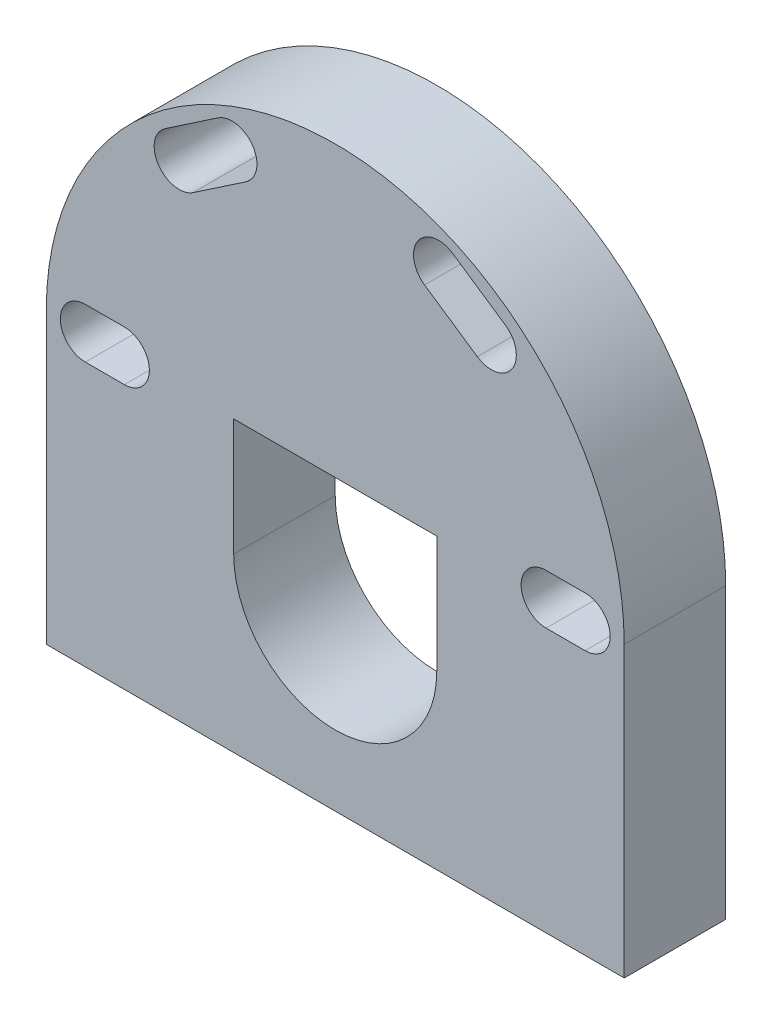
ISO-10303-21;
HEADER;
FILE_DESCRIPTION(('STEP AP214'),'2;1');
FILE_NAME('part.step','',(''),(''),'','','');
FILE_SCHEMA(('AUTOMOTIVE_DESIGN { 1 0 10303 214 1 1 1 1 }'));
ENDSEC;
DATA;
#1=APPLICATION_CONTEXT('core data for automotive mechanical design processes');
#2=APPLICATION_PROTOCOL_DEFINITION('international standard','automotive_design',2000,#1);
#3=PRODUCT_CONTEXT('',#1,'mechanical');
#4=PRODUCT('Part','Part','',(#3));
#5=PRODUCT_RELATED_PRODUCT_CATEGORY('part','',(#4));
#6=PRODUCT_DEFINITION_FORMATION('','',#4);
#7=PRODUCT_DEFINITION_CONTEXT('part definition',#1,'design');
#8=PRODUCT_DEFINITION('design','',#6,#7);
#9=PRODUCT_DEFINITION_SHAPE('','',#8);
#10=(LENGTH_UNIT() NAMED_UNIT(*) SI_UNIT(.MILLI.,.METRE.));
#11=(NAMED_UNIT(*) PLANE_ANGLE_UNIT() SI_UNIT($,.RADIAN.));
#12=(NAMED_UNIT(*) SI_UNIT($,.STERADIAN.) SOLID_ANGLE_UNIT());
#13=UNCERTAINTY_MEASURE_WITH_UNIT(LENGTH_MEASURE(1.E-05),#10,'distance_accuracy_value','');
#14=(GEOMETRIC_REPRESENTATION_CONTEXT(3) GLOBAL_UNCERTAINTY_ASSIGNED_CONTEXT((#13)) GLOBAL_UNIT_ASSIGNED_CONTEXT((#10,
#11,#12)) REPRESENTATION_CONTEXT('',''));
#15=CARTESIAN_POINT('',(0.,0.,0.));
#16=DIRECTION('',(0.,0.,1.));
#17=DIRECTION('',(1.,0.,0.));
#18=AXIS2_PLACEMENT_3D('',#15,#16,#17);
#19=CARTESIAN_POINT('',(0.,0.,0.));
#20=DIRECTION('',(0.,0.,1.));
#21=DIRECTION('',(1.,0.,0.));
#22=AXIS2_PLACEMENT_3D('',#19,#20,#21);
#23=PLANE('',#22);
#24=DIRECTION('',(-1.,0.,0.));
#25=VECTOR('',#24,1.);
#26=CARTESIAN_POINT('',(-16.,1.6,0.));
#27=LINE('',#26,#25);
#28=CARTESIAN_POINT('',(-13.5,1.6,0.));
#29=VERTEX_POINT('',#28);
#30=CARTESIAN_POINT('',(-16.,1.6,0.));
#31=VERTEX_POINT('',#30);
#32=EDGE_CURVE('E276',#29,#31,#27,.T.);
#33=ORIENTED_EDGE('',*,*,#32,.T.);
#34=CARTESIAN_POINT('',(-16.,0.,0.));
#35=DIRECTION('',(0.,0.,1.));
#36=DIRECTION('',(1.,0.,0.));
#37=AXIS2_PLACEMENT_3D('',#34,#35,#36);
#38=CIRCLE('',#37,1.6);
#39=CARTESIAN_POINT('',(-16.,-1.6,0.));
#40=VERTEX_POINT('',#39);
#41=EDGE_CURVE('E241',#31,#40,#38,.T.);
#42=ORIENTED_EDGE('',*,*,#41,.T.);
#43=DIRECTION('',(1.,0.,0.));
#44=VECTOR('',#43,1.);
#45=CARTESIAN_POINT('',(-16.,-1.6,0.));
#46=LINE('',#45,#44);
#47=CARTESIAN_POINT('',(-13.5,-1.6,0.));
#48=VERTEX_POINT('',#47);
#49=EDGE_CURVE('E282',#40,#48,#46,.T.);
#50=ORIENTED_EDGE('',*,*,#49,.T.);
#51=CARTESIAN_POINT('',(-13.5,0.,0.));
#52=DIRECTION('',(0.,0.,1.));
#53=DIRECTION('',(1.,0.,0.));
#54=AXIS2_PLACEMENT_3D('',#51,#52,#53);
#55=CIRCLE('',#54,1.6);
#56=EDGE_CURVE('E279',#48,#29,#55,.T.);
#57=ORIENTED_EDGE('',*,*,#56,.T.);
#58=EDGE_LOOP('',(#33,#42,#50,#57));
#59=FACE_BOUND('',#58,.T.);
#60=DIRECTION('',(1.,0.,0.));
#61=VECTOR('',#60,1.);
#62=CARTESIAN_POINT('',(16.,-1.6,0.));
#63=LINE('',#62,#61);
#64=CARTESIAN_POINT('',(13.5,-1.6,0.));
#65=VERTEX_POINT('',#64);
#66=CARTESIAN_POINT('',(16.,-1.6,0.));
#67=VERTEX_POINT('',#66);
#68=EDGE_CURVE('E281',#65,#67,#63,.T.);
#69=ORIENTED_EDGE('',*,*,#68,.T.);
#70=CARTESIAN_POINT('',(16.,0.,0.));
#71=DIRECTION('',(0.,0.,1.));
#72=DIRECTION('',(1.,0.,0.));
#73=AXIS2_PLACEMENT_3D('',#70,#71,#72);
#74=CIRCLE('',#73,1.6);
#75=CARTESIAN_POINT('',(16.,1.6,0.));
#76=VERTEX_POINT('',#75);
#77=EDGE_CURVE('E260',#67,#76,#74,.T.);
#78=ORIENTED_EDGE('',*,*,#77,.T.);
#79=DIRECTION('',(-1.,0.,0.));
#80=VECTOR('',#79,1.);
#81=CARTESIAN_POINT('',(16.,1.6,0.));
#82=LINE('',#81,#80);
#83=CARTESIAN_POINT('',(13.5,1.6,0.));
#84=VERTEX_POINT('',#83);
#85=EDGE_CURVE('E432',#76,#84,#82,.T.);
#86=ORIENTED_EDGE('',*,*,#85,.T.);
#87=CARTESIAN_POINT('',(13.5,0.,0.));
#88=DIRECTION('',(0.,0.,1.));
#89=DIRECTION('',(1.,0.,0.));
#90=AXIS2_PLACEMENT_3D('',#87,#88,#89);
#91=CIRCLE('',#90,1.6);
#92=EDGE_CURVE('E403',#84,#65,#91,.T.);
#93=ORIENTED_EDGE('',*,*,#92,.T.);
#94=EDGE_LOOP('',(#69,#78,#86,#93));
#95=FACE_BOUND('',#94,.T.);
#96=DIRECTION('',(-0.828048806803695,0.560656020703405,0.));
#97=VECTOR('',#96,1.);
#98=CARTESIAN_POINT('',(7.51015429243131,16.1866025572081,0.));
#99=LINE('',#98,#97);
#100=CARTESIAN_POINT('',(10.8905119619887,13.8978269874638,0.));
#101=VERTEX_POINT('',#100);
#102=CARTESIAN_POINT('',(7.51015429243131,16.1866025572081,0.));
#103=VERTEX_POINT('',#102);
#104=EDGE_CURVE('E399',#101,#103,#99,.T.);
#105=ORIENTED_EDGE('',*,*,#104,.T.);
#106=CARTESIAN_POINT('',(6.61310465930587,14.8617244663222,0.));
#107=DIRECTION('',(0.,0.,1.));
#108=DIRECTION('',(1.,0.,0.));
#109=AXIS2_PLACEMENT_3D('',#106,#107,#108);
#110=CIRCLE('',#109,1.6);
#111=CARTESIAN_POINT('',(5.71605502618042,13.5368463754363,0.));
#112=VERTEX_POINT('',#111);
#113=EDGE_CURVE('E402',#103,#112,#110,.T.);
#114=ORIENTED_EDGE('',*,*,#113,.T.);
#115=DIRECTION('',(0.828048806803695,-0.560656020703404,0.));
#116=VECTOR('',#115,1.);
#117=CARTESIAN_POINT('',(5.71605502618042,13.5368463754363,0.));
#118=LINE('',#117,#116);
#119=CARTESIAN_POINT('',(9.09641269573776,11.2480708056919,0.));
#120=VERTEX_POINT('',#119);
#121=EDGE_CURVE('E406',#112,#120,#118,.T.);
#122=ORIENTED_EDGE('',*,*,#121,.T.);
#123=CARTESIAN_POINT('',(9.99346232886321,12.5729488965779,0.));
#124=DIRECTION('',(0.,0.,1.));
#125=DIRECTION('',(1.,0.,0.));
#126=AXIS2_PLACEMENT_3D('',#123,#124,#125);
#127=CIRCLE('',#126,1.6);
#128=EDGE_CURVE('E372',#120,#101,#127,.T.);
#129=ORIENTED_EDGE('',*,*,#128,.T.);
#130=EDGE_LOOP('',(#105,#114,#122,#129));
#131=FACE_BOUND('',#130,.T.);
#132=DIRECTION('',(0.828048806803695,0.560656020703405,0.));
#133=VECTOR('',#132,1.);
#134=CARTESIAN_POINT('',(-5.71605502618043,13.5368463754363,0.));
#135=LINE('',#134,#133);
#136=CARTESIAN_POINT('',(-9.09641269573777,11.2480708056919,0.));
#137=VERTEX_POINT('',#136);
#138=CARTESIAN_POINT('',(-5.71605502618043,13.5368463754363,0.));
#139=VERTEX_POINT('',#138);
#140=EDGE_CURVE('E368',#137,#139,#135,.T.);
#141=ORIENTED_EDGE('',*,*,#140,.T.);
#142=CARTESIAN_POINT('',(-6.61310465930588,14.8617244663222,0.));
#143=DIRECTION('',(0.,0.,1.));
#144=DIRECTION('',(-1.,0.,0.));
#145=AXIS2_PLACEMENT_3D('',#142,#143,#144);
#146=CIRCLE('',#145,1.6);
#147=CARTESIAN_POINT('',(-7.51015429243133,16.1866025572081,0.));
#148=VERTEX_POINT('',#147);
#149=EDGE_CURVE('E371',#139,#148,#146,.T.);
#150=ORIENTED_EDGE('',*,*,#149,.T.);
#151=DIRECTION('',(-0.828048806803695,-0.560656020703405,0.));
#152=VECTOR('',#151,1.);
#153=CARTESIAN_POINT('',(-7.51015429243133,16.1866025572081,0.));
#154=LINE('',#153,#152);
#155=CARTESIAN_POINT('',(-10.8905119619887,13.8978269874638,0.));
#156=VERTEX_POINT('',#155);
#157=EDGE_CURVE('E375',#148,#156,#154,.T.);
#158=ORIENTED_EDGE('',*,*,#157,.T.);
#159=CARTESIAN_POINT('',(-9.99346232886322,12.5729488965778,0.));
#160=DIRECTION('',(0.,0.,1.));
#161=DIRECTION('',(-1.,0.,0.));
#162=AXIS2_PLACEMENT_3D('',#159,#160,#161);
#163=CIRCLE('',#162,1.6);
#164=EDGE_CURVE('E340',#156,#137,#163,.T.);
#165=ORIENTED_EDGE('',*,*,#164,.T.);
#166=EDGE_LOOP('',(#141,#150,#158,#165));
#167=FACE_BOUND('',#166,.T.);
#168=DIRECTION('',(0.,-1.,0.));
#169=VECTOR('',#168,1.);
#170=CARTESIAN_POINT('',(-6.5,0.,0.));
#171=LINE('',#170,#169);
#172=CARTESIAN_POINT('',(-6.5,0.,0.));
#173=VERTEX_POINT('',#172);
#174=CARTESIAN_POINT('',(-6.5,-7.5,0.));
#175=VERTEX_POINT('',#174);
#176=EDGE_CURVE('E336',#173,#175,#171,.T.);
#177=ORIENTED_EDGE('',*,*,#176,.T.);
#178=CARTESIAN_POINT('',(0.,-7.5,0.));
#179=DIRECTION('',(0.,0.,1.));
#180=DIRECTION('',(1.,0.,0.));
#181=AXIS2_PLACEMENT_3D('',#178,#179,#180);
#182=CIRCLE('',#181,6.5);
#183=CARTESIAN_POINT('',(6.5,-7.5,0.));
#184=VERTEX_POINT('',#183);
#185=EDGE_CURVE('E339',#175,#184,#182,.T.);
#186=ORIENTED_EDGE('',*,*,#185,.T.);
#187=DIRECTION('',(0.,1.,0.));
#188=VECTOR('',#187,1.);
#189=CARTESIAN_POINT('',(6.5,0.,0.));
#190=LINE('',#189,#188);
#191=CARTESIAN_POINT('',(6.5,0.,0.));
#192=VERTEX_POINT('',#191);
#193=EDGE_CURVE('E343',#184,#192,#190,.T.);
#194=ORIENTED_EDGE('',*,*,#193,.T.);
#195=DIRECTION('',(-1.,0.,0.));
#196=VECTOR('',#195,1.);
#197=CARTESIAN_POINT('',(-6.5,0.,0.));
#198=LINE('',#197,#196);
#199=EDGE_CURVE('E244',#192,#173,#198,.T.);
#200=ORIENTED_EDGE('',*,*,#199,.T.);
#201=EDGE_LOOP('',(#177,#186,#194,#200));
#202=FACE_BOUND('',#201,.T.);
#203=DIRECTION('',(1.,0.,0.));
#204=VECTOR('',#203,1.);
#205=CARTESIAN_POINT('',(0.,-18.5,0.));
#206=LINE('',#205,#204);
#207=CARTESIAN_POINT('',(-18.5,-18.5,0.));
#208=VERTEX_POINT('',#207);
#209=CARTESIAN_POINT('',(18.5,-18.5,0.));
#210=VERTEX_POINT('',#209);
#211=EDGE_CURVE('E61',#208,#210,#206,.T.);
#212=ORIENTED_EDGE('',*,*,#211,.F.);
#213=DIRECTION('',(0.,-1.,0.));
#214=VECTOR('',#213,1.);
#215=CARTESIAN_POINT('',(-18.5,0.,0.));
#216=LINE('',#215,#214);
#217=CARTESIAN_POINT('',(-18.5,0.,0.));
#218=VERTEX_POINT('',#217);
#219=EDGE_CURVE('E234',#218,#208,#216,.T.);
#220=ORIENTED_EDGE('',*,*,#219,.F.);
#221=CARTESIAN_POINT('',(0.,0.,0.));
#222=DIRECTION('',(0.,0.,1.));
#223=DIRECTION('',(1.,0.,0.));
#224=AXIS2_PLACEMENT_3D('',#221,#222,#223);
#225=CIRCLE('',#224,18.5);
#226=CARTESIAN_POINT('',(18.5,0.,0.));
#227=VERTEX_POINT('',#226);
#228=EDGE_CURVE('E221',#227,#218,#225,.T.);
#229=ORIENTED_EDGE('',*,*,#228,.F.);
#230=DIRECTION('',(0.,1.,0.));
#231=VECTOR('',#230,1.);
#232=CARTESIAN_POINT('',(18.5,0.,0.));
#233=LINE('',#232,#231);
#234=EDGE_CURVE('E232',#210,#227,#233,.T.);
#235=ORIENTED_EDGE('',*,*,#234,.F.);
#236=EDGE_LOOP('',(#212,#220,#229,#235));
#237=FACE_BOUND('',#236,.T.);
#238=ADVANCED_FACE('F52',(#59,#95,#131,#167,#202,#237),#23,.F.);
#239=CARTESIAN_POINT('',(18.5,0.,6.5));
#240=DIRECTION('',(-1.,0.,0.));
#241=DIRECTION('',(0.,0.,1.));
#242=AXIS2_PLACEMENT_3D('',#239,#240,#241);
#243=PLANE('',#242);
#244=DIRECTION('',(0.,0.,1.));
#245=VECTOR('',#244,1.);
#246=CARTESIAN_POINT('',(18.5,-18.5,6.5));
#247=LINE('',#246,#245);
#248=CARTESIAN_POINT('',(18.5,-18.5,6.5));
#249=VERTEX_POINT('',#248);
#250=EDGE_CURVE('E12',#210,#249,#247,.T.);
#251=ORIENTED_EDGE('',*,*,#250,.F.);
#252=ORIENTED_EDGE('',*,*,#234,.T.);
#253=DIRECTION('',(0.,0.,-1.));
#254=VECTOR('',#253,1.);
#255=CARTESIAN_POINT('',(18.5,0.,6.5));
#256=LINE('',#255,#254);
#257=CARTESIAN_POINT('',(18.5,0.,6.5));
#258=VERTEX_POINT('',#257);
#259=EDGE_CURVE('E216',#258,#227,#256,.T.);
#260=ORIENTED_EDGE('',*,*,#259,.F.);
#261=DIRECTION('',(0.,1.,0.));
#262=VECTOR('',#261,1.);
#263=CARTESIAN_POINT('',(18.5,0.,6.5));
#264=LINE('',#263,#262);
#265=EDGE_CURVE('E224',#249,#258,#264,.T.);
#266=ORIENTED_EDGE('',*,*,#265,.F.);
#267=EDGE_LOOP('',(#251,#252,#260,#266));
#268=FACE_BOUND('',#267,.T.);
#269=ADVANCED_FACE('F230',(#268),#243,.F.);
#270=CARTESIAN_POINT('',(-18.5,0.,6.5));
#271=DIRECTION('',(1.,0.,0.));
#272=DIRECTION('',(0.,0.,-1.));
#273=AXIS2_PLACEMENT_3D('',#270,#271,#272);
#274=PLANE('',#273);
#275=DIRECTION('',(0.,0.,1.));
#276=VECTOR('',#275,1.);
#277=CARTESIAN_POINT('',(-18.5,-18.5,243.5));
#278=LINE('',#277,#276);
#279=CARTESIAN_POINT('',(-18.5,-18.5,6.50000000000001));
#280=VERTEX_POINT('',#279);
#281=EDGE_CURVE('E56',#208,#280,#278,.T.);
#282=ORIENTED_EDGE('',*,*,#281,.T.);
#283=DIRECTION('',(0.,-1.,0.));
#284=VECTOR('',#283,1.);
#285=CARTESIAN_POINT('',(-18.5,0.,6.5));
#286=LINE('',#285,#284);
#287=CARTESIAN_POINT('',(-18.5,0.,6.5));
#288=VERTEX_POINT('',#287);
#289=EDGE_CURVE('E220',#288,#280,#286,.T.);
#290=ORIENTED_EDGE('',*,*,#289,.F.);
#291=DIRECTION('',(0.,0.,-1.));
#292=VECTOR('',#291,1.);
#293=CARTESIAN_POINT('',(-18.5,0.,6.5));
#294=LINE('',#293,#292);
#295=EDGE_CURVE('E217',#288,#218,#294,.T.);
#296=ORIENTED_EDGE('',*,*,#295,.T.);
#297=ORIENTED_EDGE('',*,*,#219,.T.);
#298=EDGE_LOOP('',(#282,#290,#296,#297));
#299=FACE_BOUND('',#298,.T.);
#300=ADVANCED_FACE('F54',(#299),#274,.F.);
#301=CARTESIAN_POINT('',(0.,0.,6.5));
#302=DIRECTION('',(0.,0.,-1.));
#303=DIRECTION('',(-1.,0.,0.));
#304=AXIS2_PLACEMENT_3D('',#301,#302,#303);
#305=CYLINDRICAL_SURFACE('',#304,18.5);
#306=ORIENTED_EDGE('',*,*,#295,.F.);
#307=CARTESIAN_POINT('',(0.,0.,6.5));
#308=DIRECTION('',(0.,0.,1.));
#309=DIRECTION('',(1.,0.,0.));
#310=AXIS2_PLACEMENT_3D('',#307,#308,#309);
#311=CIRCLE('',#310,18.5);
#312=EDGE_CURVE('E211',#258,#288,#311,.T.);
#313=ORIENTED_EDGE('',*,*,#312,.F.);
#314=ORIENTED_EDGE('',*,*,#259,.T.);
#315=ORIENTED_EDGE('',*,*,#228,.T.);
#316=EDGE_LOOP('',(#306,#313,#314,#315));
#317=FACE_BOUND('',#316,.T.);
#318=ADVANCED_FACE('F213',(#317),#305,.T.);
#319=CARTESIAN_POINT('',(0.,0.,6.5));
#320=DIRECTION('',(0.,0.,1.));
#321=DIRECTION('',(1.,0.,0.));
#322=AXIS2_PLACEMENT_3D('',#319,#320,#321);
#323=PLANE('',#322);
#324=CARTESIAN_POINT('',(-16.,0.,6.5));
#325=DIRECTION('',(0.,0.,1.));
#326=DIRECTION('',(1.,0.,0.));
#327=AXIS2_PLACEMENT_3D('',#324,#325,#326);
#328=CIRCLE('',#327,1.6);
#329=CARTESIAN_POINT('',(-16.,1.6,6.5));
#330=VERTEX_POINT('',#329);
#331=CARTESIAN_POINT('',(-16.,-1.6,6.5));
#332=VERTEX_POINT('',#331);
#333=EDGE_CURVE('E269',#330,#332,#328,.T.);
#334=ORIENTED_EDGE('',*,*,#333,.F.);
#335=DIRECTION('',(-1.,0.,0.));
#336=VECTOR('',#335,1.);
#337=CARTESIAN_POINT('',(-16.,1.6,6.5));
#338=LINE('',#337,#336);
#339=CARTESIAN_POINT('',(-13.5,1.6,6.5));
#340=VERTEX_POINT('',#339);
#341=EDGE_CURVE('E266',#340,#330,#338,.T.);
#342=ORIENTED_EDGE('',*,*,#341,.F.);
#343=CARTESIAN_POINT('',(-13.5,0.,6.5));
#344=DIRECTION('',(0.,0.,1.));
#345=DIRECTION('',(1.,0.,0.));
#346=AXIS2_PLACEMENT_3D('',#343,#344,#345);
#347=CIRCLE('',#346,1.6);
#348=CARTESIAN_POINT('',(-13.5,-1.6,6.5));
#349=VERTEX_POINT('',#348);
#350=EDGE_CURVE('E263',#349,#340,#347,.T.);
#351=ORIENTED_EDGE('',*,*,#350,.F.);
#352=DIRECTION('',(1.,0.,0.));
#353=VECTOR('',#352,1.);
#354=CARTESIAN_POINT('',(-16.,-1.6,6.5));
#355=LINE('',#354,#353);
#356=EDGE_CURVE('E250',#332,#349,#355,.T.);
#357=ORIENTED_EDGE('',*,*,#356,.F.);
#358=EDGE_LOOP('',(#334,#342,#351,#357));
#359=FACE_BOUND('',#358,.T.);
#360=CARTESIAN_POINT('',(16.,0.,6.5));
#361=DIRECTION('',(0.,0.,1.));
#362=DIRECTION('',(1.,0.,0.));
#363=AXIS2_PLACEMENT_3D('',#360,#361,#362);
#364=CIRCLE('',#363,1.6);
#365=CARTESIAN_POINT('',(16.,-1.6,6.5));
#366=VERTEX_POINT('',#365);
#367=CARTESIAN_POINT('',(16.,1.6,6.5));
#368=VERTEX_POINT('',#367);
#369=EDGE_CURVE('E309',#366,#368,#364,.T.);
#370=ORIENTED_EDGE('',*,*,#369,.F.);
#371=DIRECTION('',(1.,0.,0.));
#372=VECTOR('',#371,1.);
#373=CARTESIAN_POINT('',(16.,-1.6,6.5));
#374=LINE('',#373,#372);
#375=CARTESIAN_POINT('',(13.5,-1.6,6.5));
#376=VERTEX_POINT('',#375);
#377=EDGE_CURVE('E419',#376,#366,#374,.T.);
#378=ORIENTED_EDGE('',*,*,#377,.F.);
#379=CARTESIAN_POINT('',(13.5,0.,6.5));
#380=DIRECTION('',(0.,0.,1.));
#381=DIRECTION('',(1.,0.,0.));
#382=AXIS2_PLACEMENT_3D('',#379,#380,#381);
#383=CIRCLE('',#382,1.6);
#384=CARTESIAN_POINT('',(13.5,1.6,6.5));
#385=VERTEX_POINT('',#384);
#386=EDGE_CURVE('E416',#385,#376,#383,.T.);
#387=ORIENTED_EDGE('',*,*,#386,.F.);
#388=DIRECTION('',(-1.,0.,0.));
#389=VECTOR('',#388,1.);
#390=CARTESIAN_POINT('',(16.,1.6,6.5));
#391=LINE('',#390,#389);
#392=EDGE_CURVE('E413',#368,#385,#391,.T.);
#393=ORIENTED_EDGE('',*,*,#392,.F.);
#394=EDGE_LOOP('',(#370,#378,#387,#393));
#395=FACE_BOUND('',#394,.T.);
#396=CARTESIAN_POINT('',(6.61310465930587,14.8617244663222,6.5));
#397=DIRECTION('',(0.,0.,1.));
#398=DIRECTION('',(1.,0.,0.));
#399=AXIS2_PLACEMENT_3D('',#396,#397,#398);
#400=CIRCLE('',#399,1.6);
#401=CARTESIAN_POINT('',(7.51015429243131,16.1866025572081,6.5));
#402=VERTEX_POINT('',#401);
#403=CARTESIAN_POINT('',(5.71605502618042,13.5368463754363,6.5));
#404=VERTEX_POINT('',#403);
#405=EDGE_CURVE('E314',#402,#404,#400,.T.);
#406=ORIENTED_EDGE('',*,*,#405,.F.);
#407=DIRECTION('',(-0.828048806803695,0.560656020703405,0.));
#408=VECTOR('',#407,1.);
#409=CARTESIAN_POINT('',(7.51015429243131,16.1866025572081,6.5));
#410=LINE('',#409,#408);
#411=CARTESIAN_POINT('',(10.8905119619887,13.8978269874638,6.5));
#412=VERTEX_POINT('',#411);
#413=EDGE_CURVE('E389',#412,#402,#410,.T.);
#414=ORIENTED_EDGE('',*,*,#413,.F.);
#415=CARTESIAN_POINT('',(9.99346232886321,12.5729488965779,6.5));
#416=DIRECTION('',(0.,0.,1.));
#417=DIRECTION('',(1.,0.,0.));
#418=AXIS2_PLACEMENT_3D('',#415,#416,#417);
#419=CIRCLE('',#418,1.6);
#420=CARTESIAN_POINT('',(9.09641269573776,11.2480708056919,6.5));
#421=VERTEX_POINT('',#420);
#422=EDGE_CURVE('E386',#421,#412,#419,.T.);
#423=ORIENTED_EDGE('',*,*,#422,.F.);
#424=DIRECTION('',(0.828048806803695,-0.560656020703404,0.));
#425=VECTOR('',#424,1.);
#426=CARTESIAN_POINT('',(5.71605502618042,13.5368463754363,6.5));
#427=LINE('',#426,#425);
#428=EDGE_CURVE('E383',#404,#421,#427,.T.);
#429=ORIENTED_EDGE('',*,*,#428,.F.);
#430=EDGE_LOOP('',(#406,#414,#423,#429));
#431=FACE_BOUND('',#430,.T.);
#432=CARTESIAN_POINT('',(-6.61310465930588,14.8617244663222,6.5));
#433=DIRECTION('',(0.,0.,1.));
#434=DIRECTION('',(-1.,0.,0.));
#435=AXIS2_PLACEMENT_3D('',#432,#433,#434);
#436=CIRCLE('',#435,1.6);
#437=CARTESIAN_POINT('',(-5.71605502618043,13.5368463754363,6.5));
#438=VERTEX_POINT('',#437);
#439=CARTESIAN_POINT('',(-7.51015429243133,16.1866025572081,6.5));
#440=VERTEX_POINT('',#439);
#441=EDGE_CURVE('E319',#438,#440,#436,.T.);
#442=ORIENTED_EDGE('',*,*,#441,.F.);
#443=DIRECTION('',(0.828048806803695,0.560656020703405,0.));
#444=VECTOR('',#443,1.);
#445=CARTESIAN_POINT('',(-5.71605502618043,13.5368463754363,6.5));
#446=LINE('',#445,#444);
#447=CARTESIAN_POINT('',(-9.09641269573777,11.2480708056919,6.5));
#448=VERTEX_POINT('',#447);
#449=EDGE_CURVE('E357',#448,#438,#446,.T.);
#450=ORIENTED_EDGE('',*,*,#449,.F.);
#451=CARTESIAN_POINT('',(-9.99346232886322,12.5729488965778,6.5));
#452=DIRECTION('',(0.,0.,1.));
#453=DIRECTION('',(-1.,0.,0.));
#454=AXIS2_PLACEMENT_3D('',#451,#452,#453);
#455=CIRCLE('',#454,1.6);
#456=CARTESIAN_POINT('',(-10.8905119619887,13.8978269874638,6.5));
#457=VERTEX_POINT('',#456);
#458=EDGE_CURVE('E354',#457,#448,#455,.T.);
#459=ORIENTED_EDGE('',*,*,#458,.F.);
#460=DIRECTION('',(-0.828048806803695,-0.560656020703405,0.));
#461=VECTOR('',#460,1.);
#462=CARTESIAN_POINT('',(-7.51015429243133,16.1866025572081,6.5));
#463=LINE('',#462,#461);
#464=EDGE_CURVE('E351',#440,#457,#463,.T.);
#465=ORIENTED_EDGE('',*,*,#464,.F.);
#466=EDGE_LOOP('',(#442,#450,#459,#465));
#467=FACE_BOUND('',#466,.T.);
#468=CARTESIAN_POINT('',(0.,-7.5,6.5));
#469=DIRECTION('',(0.,0.,1.));
#470=DIRECTION('',(1.,0.,0.));
#471=AXIS2_PLACEMENT_3D('',#468,#469,#470);
#472=CIRCLE('',#471,6.5);
#473=CARTESIAN_POINT('',(-6.5,-7.5,6.5));
#474=VERTEX_POINT('',#473);
#475=CARTESIAN_POINT('',(6.5,-7.5,6.5));
#476=VERTEX_POINT('',#475);
#477=EDGE_CURVE('E228',#474,#476,#472,.T.);
#478=ORIENTED_EDGE('',*,*,#477,.F.);
#479=DIRECTION('',(0.,-1.,0.));
#480=VECTOR('',#479,1.);
#481=CARTESIAN_POINT('',(-6.5,0.,6.5));
#482=LINE('',#481,#480);
#483=CARTESIAN_POINT('',(-6.5,0.,6.5));
#484=VERTEX_POINT('',#483);
#485=EDGE_CURVE('E325',#484,#474,#482,.T.);
#486=ORIENTED_EDGE('',*,*,#485,.F.);
#487=DIRECTION('',(-1.,0.,0.));
#488=VECTOR('',#487,1.);
#489=CARTESIAN_POINT('',(-6.5,0.,6.5));
#490=LINE('',#489,#488);
#491=CARTESIAN_POINT('',(6.5,0.,6.5));
#492=VERTEX_POINT('',#491);
#493=EDGE_CURVE('E731',#492,#484,#490,.T.);
#494=ORIENTED_EDGE('',*,*,#493,.F.);
#495=DIRECTION('',(0.,1.,0.));
#496=VECTOR('',#495,1.);
#497=CARTESIAN_POINT('',(6.5,0.,6.5));
#498=LINE('',#497,#496);
#499=EDGE_CURVE('E327',#476,#492,#498,.T.);
#500=ORIENTED_EDGE('',*,*,#499,.F.);
#501=EDGE_LOOP('',(#478,#486,#494,#500));
#502=FACE_BOUND('',#501,.T.);
#503=ORIENTED_EDGE('',*,*,#312,.T.);
#504=ORIENTED_EDGE('',*,*,#289,.T.);
#505=DIRECTION('',(1.,0.,0.));
#506=VECTOR('',#505,1.);
#507=CARTESIAN_POINT('',(0.,-18.5,6.5));
#508=LINE('',#507,#506);
#509=EDGE_CURVE('E71',#280,#249,#508,.T.);
#510=ORIENTED_EDGE('',*,*,#509,.T.);
#511=ORIENTED_EDGE('',*,*,#265,.T.);
#512=EDGE_LOOP('',(#503,#504,#510,#511));
#513=FACE_BOUND('',#512,.T.);
#514=ADVANCED_FACE('F225',(#359,#395,#431,#467,#502,#513),#323,.T.);
#515=CARTESIAN_POINT('',(0.,-7.5,0.));
#516=DIRECTION('',(0.,0.,1.));
#517=DIRECTION('',(1.,0.,0.));
#518=AXIS2_PLACEMENT_3D('',#515,#516,#517);
#519=CYLINDRICAL_SURFACE('',#518,6.5);
#520=ORIENTED_EDGE('',*,*,#477,.T.);
#521=DIRECTION('',(0.,0.,1.));
#522=VECTOR('',#521,1.);
#523=CARTESIAN_POINT('',(6.5,-7.5,0.));
#524=LINE('',#523,#522);
#525=EDGE_CURVE('E367',#184,#476,#524,.T.);
#526=ORIENTED_EDGE('',*,*,#525,.F.);
#527=ORIENTED_EDGE('',*,*,#185,.F.);
#528=DIRECTION('',(0.,0.,1.));
#529=VECTOR('',#528,1.);
#530=CARTESIAN_POINT('',(-6.5,-7.5,0.));
#531=LINE('',#530,#529);
#532=EDGE_CURVE('E330',#175,#474,#531,.T.);
#533=ORIENTED_EDGE('',*,*,#532,.T.);
#534=EDGE_LOOP('',(#520,#526,#527,#533));
#535=FACE_BOUND('',#534,.T.);
#536=ADVANCED_FACE('F303',(#535),#519,.F.);
#537=CARTESIAN_POINT('',(-6.5,0.,0.));
#538=DIRECTION('',(-1.,0.,0.));
#539=DIRECTION('',(0.,-1.,0.));
#540=AXIS2_PLACEMENT_3D('',#537,#538,#539);
#541=PLANE('',#540);
#542=ORIENTED_EDGE('',*,*,#485,.T.);
#543=ORIENTED_EDGE('',*,*,#532,.F.);
#544=ORIENTED_EDGE('',*,*,#176,.F.);
#545=DIRECTION('',(0.,0.,1.));
#546=VECTOR('',#545,1.);
#547=CARTESIAN_POINT('',(-6.5,0.,0.));
#548=LINE('',#547,#546);
#549=EDGE_CURVE('E725',#173,#484,#548,.T.);
#550=ORIENTED_EDGE('',*,*,#549,.T.);
#551=EDGE_LOOP('',(#542,#543,#544,#550));
#552=FACE_BOUND('',#551,.T.);
#553=ADVANCED_FACE('F469',(#552),#541,.F.);
#554=CARTESIAN_POINT('',(-6.5,0.,0.));
#555=DIRECTION('',(0.,1.,0.));
#556=DIRECTION('',(-1.,0.,0.));
#557=AXIS2_PLACEMENT_3D('',#554,#555,#556);
#558=PLANE('',#557);
#559=ORIENTED_EDGE('',*,*,#493,.T.);
#560=ORIENTED_EDGE('',*,*,#549,.F.);
#561=ORIENTED_EDGE('',*,*,#199,.F.);
#562=DIRECTION('',(0.,0.,1.));
#563=VECTOR('',#562,1.);
#564=CARTESIAN_POINT('',(6.5,0.,0.));
#565=LINE('',#564,#563);
#566=EDGE_CURVE('E730',#192,#492,#565,.T.);
#567=ORIENTED_EDGE('',*,*,#566,.T.);
#568=EDGE_LOOP('',(#559,#560,#561,#567));
#569=FACE_BOUND('',#568,.T.);
#570=ADVANCED_FACE('F474',(#569),#558,.F.);
#571=CARTESIAN_POINT('',(6.5,0.,0.));
#572=DIRECTION('',(1.,0.,0.));
#573=DIRECTION('',(0.,1.,0.));
#574=AXIS2_PLACEMENT_3D('',#571,#572,#573);
#575=PLANE('',#574);
#576=ORIENTED_EDGE('',*,*,#499,.T.);
#577=ORIENTED_EDGE('',*,*,#566,.F.);
#578=ORIENTED_EDGE('',*,*,#193,.F.);
#579=ORIENTED_EDGE('',*,*,#525,.T.);
#580=EDGE_LOOP('',(#576,#577,#578,#579));
#581=FACE_BOUND('',#580,.T.);
#582=ADVANCED_FACE('F470',(#581),#575,.F.);
#583=CARTESIAN_POINT('',(-6.61310465930588,14.8617244663222,0.));
#584=DIRECTION('',(0.,0.,1.));
#585=DIRECTION('',(1.,0.,0.));
#586=AXIS2_PLACEMENT_3D('',#583,#584,#585);
#587=CYLINDRICAL_SURFACE('',#586,1.6);
#588=ORIENTED_EDGE('',*,*,#441,.T.);
#589=DIRECTION('',(0.,0.,1.));
#590=VECTOR('',#589,1.);
#591=CARTESIAN_POINT('',(-7.51015429243133,16.1866025572081,0.));
#592=LINE('',#591,#590);
#593=EDGE_CURVE('E348',#148,#440,#592,.T.);
#594=ORIENTED_EDGE('',*,*,#593,.F.);
#595=ORIENTED_EDGE('',*,*,#149,.F.);
#596=DIRECTION('',(0.,0.,1.));
#597=VECTOR('',#596,1.);
#598=CARTESIAN_POINT('',(-5.71605502618043,13.5368463754363,0.));
#599=LINE('',#598,#597);
#600=EDGE_CURVE('E358',#139,#438,#599,.T.);
#601=ORIENTED_EDGE('',*,*,#600,.T.);
#602=EDGE_LOOP('',(#588,#594,#595,#601));
#603=FACE_BOUND('',#602,.T.);
#604=ADVANCED_FACE('F473',(#603),#587,.F.);
#605=CARTESIAN_POINT('',(-5.71605502618043,13.5368463754363,0.));
#606=DIRECTION('',(0.560656020703405,-0.828048806803695,0.));
#607=DIRECTION('',(0.828048806803695,0.560656020703405,0.));
#608=AXIS2_PLACEMENT_3D('',#605,#606,#607);
#609=PLANE('',#608);
#610=ORIENTED_EDGE('',*,*,#449,.T.);
#611=ORIENTED_EDGE('',*,*,#600,.F.);
#612=ORIENTED_EDGE('',*,*,#140,.F.);
#613=DIRECTION('',(0.,0.,1.));
#614=VECTOR('',#613,1.);
#615=CARTESIAN_POINT('',(-9.09641269573777,11.2480708056919,0.));
#616=LINE('',#615,#614);
#617=EDGE_CURVE('E355',#137,#448,#616,.T.);
#618=ORIENTED_EDGE('',*,*,#617,.T.);
#619=EDGE_LOOP('',(#610,#611,#612,#618));
#620=FACE_BOUND('',#619,.T.);
#621=ADVANCED_FACE('F484',(#620),#609,.F.);
#622=CARTESIAN_POINT('',(-9.99346232886322,12.5729488965778,0.));
#623=DIRECTION('',(0.,0.,1.));
#624=DIRECTION('',(1.,0.,0.));
#625=AXIS2_PLACEMENT_3D('',#622,#623,#624);
#626=CYLINDRICAL_SURFACE('',#625,1.6);
#627=ORIENTED_EDGE('',*,*,#458,.T.);
#628=ORIENTED_EDGE('',*,*,#617,.F.);
#629=ORIENTED_EDGE('',*,*,#164,.F.);
#630=DIRECTION('',(0.,0.,1.));
#631=VECTOR('',#630,1.);
#632=CARTESIAN_POINT('',(-10.8905119619887,13.8978269874638,0.));
#633=LINE('',#632,#631);
#634=EDGE_CURVE('E352',#156,#457,#633,.T.);
#635=ORIENTED_EDGE('',*,*,#634,.T.);
#636=EDGE_LOOP('',(#627,#628,#629,#635));
#637=FACE_BOUND('',#636,.T.);
#638=ADVANCED_FACE('F490',(#637),#626,.F.);
#639=CARTESIAN_POINT('',(-7.51015429243133,16.1866025572081,0.));
#640=DIRECTION('',(-0.560656020703405,0.828048806803695,0.));
#641=DIRECTION('',(-0.828048806803695,-0.560656020703405,0.));
#642=AXIS2_PLACEMENT_3D('',#639,#640,#641);
#643=PLANE('',#642);
#644=ORIENTED_EDGE('',*,*,#464,.T.);
#645=ORIENTED_EDGE('',*,*,#634,.F.);
#646=ORIENTED_EDGE('',*,*,#157,.F.);
#647=ORIENTED_EDGE('',*,*,#593,.T.);
#648=EDGE_LOOP('',(#644,#645,#646,#647));
#649=FACE_BOUND('',#648,.T.);
#650=ADVANCED_FACE('F486',(#649),#643,.F.);
#651=CARTESIAN_POINT('',(6.61310465930587,14.8617244663222,0.));
#652=DIRECTION('',(0.,0.,1.));
#653=DIRECTION('',(1.,0.,0.));
#654=AXIS2_PLACEMENT_3D('',#651,#652,#653);
#655=CYLINDRICAL_SURFACE('',#654,1.6);
#656=ORIENTED_EDGE('',*,*,#405,.T.);
#657=DIRECTION('',(0.,0.,1.));
#658=VECTOR('',#657,1.);
#659=CARTESIAN_POINT('',(5.71605502618042,13.5368463754363,0.));
#660=LINE('',#659,#658);
#661=EDGE_CURVE('E380',#112,#404,#660,.T.);
#662=ORIENTED_EDGE('',*,*,#661,.F.);
#663=ORIENTED_EDGE('',*,*,#113,.F.);
#664=DIRECTION('',(0.,0.,1.));
#665=VECTOR('',#664,1.);
#666=CARTESIAN_POINT('',(7.51015429243131,16.1866025572081,0.));
#667=LINE('',#666,#665);
#668=EDGE_CURVE('E390',#103,#402,#667,.T.);
#669=ORIENTED_EDGE('',*,*,#668,.T.);
#670=EDGE_LOOP('',(#656,#662,#663,#669));
#671=FACE_BOUND('',#670,.T.);
#672=ADVANCED_FACE('F489',(#671),#655,.F.);
#673=CARTESIAN_POINT('',(7.51015429243131,16.1866025572081,0.));
#674=DIRECTION('',(0.560656020703405,0.828048806803695,0.));
#675=DIRECTION('',(-0.828048806803695,0.560656020703405,0.));
#676=AXIS2_PLACEMENT_3D('',#673,#674,#675);
#677=PLANE('',#676);
#678=ORIENTED_EDGE('',*,*,#413,.T.);
#679=ORIENTED_EDGE('',*,*,#668,.F.);
#680=ORIENTED_EDGE('',*,*,#104,.F.);
#681=DIRECTION('',(0.,0.,1.));
#682=VECTOR('',#681,1.);
#683=CARTESIAN_POINT('',(10.8905119619887,13.8978269874638,0.));
#684=LINE('',#683,#682);
#685=EDGE_CURVE('E387',#101,#412,#684,.T.);
#686=ORIENTED_EDGE('',*,*,#685,.T.);
#687=EDGE_LOOP('',(#678,#679,#680,#686));
#688=FACE_BOUND('',#687,.T.);
#689=ADVANCED_FACE('F500',(#688),#677,.F.);
#690=CARTESIAN_POINT('',(9.99346232886321,12.5729488965779,0.));
#691=DIRECTION('',(0.,0.,1.));
#692=DIRECTION('',(1.,0.,0.));
#693=AXIS2_PLACEMENT_3D('',#690,#691,#692);
#694=CYLINDRICAL_SURFACE('',#693,1.6);
#695=ORIENTED_EDGE('',*,*,#422,.T.);
#696=ORIENTED_EDGE('',*,*,#685,.F.);
#697=ORIENTED_EDGE('',*,*,#128,.F.);
#698=DIRECTION('',(0.,0.,1.));
#699=VECTOR('',#698,1.);
#700=CARTESIAN_POINT('',(9.09641269573776,11.2480708056919,0.));
#701=LINE('',#700,#699);
#702=EDGE_CURVE('E384',#120,#421,#701,.T.);
#703=ORIENTED_EDGE('',*,*,#702,.T.);
#704=EDGE_LOOP('',(#695,#696,#697,#703));
#705=FACE_BOUND('',#704,.T.);
#706=ADVANCED_FACE('F504',(#705),#694,.F.);
#707=CARTESIAN_POINT('',(5.71605502618042,13.5368463754363,0.));
#708=DIRECTION('',(-0.560656020703404,-0.828048806803695,0.));
#709=DIRECTION('',(0.828048806803696,-0.560656020703404,0.));
#710=AXIS2_PLACEMENT_3D('',#707,#708,#709);
#711=PLANE('',#710);
#712=ORIENTED_EDGE('',*,*,#428,.T.);
#713=ORIENTED_EDGE('',*,*,#702,.F.);
#714=ORIENTED_EDGE('',*,*,#121,.F.);
#715=ORIENTED_EDGE('',*,*,#661,.T.);
#716=EDGE_LOOP('',(#712,#713,#714,#715));
#717=FACE_BOUND('',#716,.T.);
#718=ADVANCED_FACE('F456',(#717),#711,.F.);
#719=CARTESIAN_POINT('',(16.,0.,0.));
#720=DIRECTION('',(0.,0.,1.));
#721=DIRECTION('',(1.,0.,0.));
#722=AXIS2_PLACEMENT_3D('',#719,#720,#721);
#723=CYLINDRICAL_SURFACE('',#722,1.6);
#724=ORIENTED_EDGE('',*,*,#369,.T.);
#725=DIRECTION('',(0.,0.,1.));
#726=VECTOR('',#725,1.);
#727=CARTESIAN_POINT('',(16.,1.6,0.));
#728=LINE('',#727,#726);
#729=EDGE_CURVE('E275',#76,#368,#728,.T.);
#730=ORIENTED_EDGE('',*,*,#729,.F.);
#731=ORIENTED_EDGE('',*,*,#77,.F.);
#732=DIRECTION('',(0.,0.,1.));
#733=VECTOR('',#732,1.);
#734=CARTESIAN_POINT('',(16.,-1.6,0.));
#735=LINE('',#734,#733);
#736=EDGE_CURVE('E420',#67,#366,#735,.T.);
#737=ORIENTED_EDGE('',*,*,#736,.T.);
#738=EDGE_LOOP('',(#724,#730,#731,#737));
#739=FACE_BOUND('',#738,.T.);
#740=ADVANCED_FACE('F440',(#739),#723,.F.);
#741=CARTESIAN_POINT('',(16.,-1.6,0.));
#742=DIRECTION('',(0.,-1.,0.));
#743=DIRECTION('',(1.,0.,0.));
#744=AXIS2_PLACEMENT_3D('',#741,#742,#743);
#745=PLANE('',#744);
#746=ORIENTED_EDGE('',*,*,#377,.T.);
#747=ORIENTED_EDGE('',*,*,#736,.F.);
#748=ORIENTED_EDGE('',*,*,#68,.F.);
#749=DIRECTION('',(0.,0.,1.));
#750=VECTOR('',#749,1.);
#751=CARTESIAN_POINT('',(13.5,-1.6,0.));
#752=LINE('',#751,#750);
#753=EDGE_CURVE('E417',#65,#376,#752,.T.);
#754=ORIENTED_EDGE('',*,*,#753,.T.);
#755=EDGE_LOOP('',(#746,#747,#748,#754));
#756=FACE_BOUND('',#755,.T.);
#757=ADVANCED_FACE('F448',(#756),#745,.F.);
#758=CARTESIAN_POINT('',(13.5,0.,0.));
#759=DIRECTION('',(0.,0.,1.));
#760=DIRECTION('',(1.,0.,0.));
#761=AXIS2_PLACEMENT_3D('',#758,#759,#760);
#762=CYLINDRICAL_SURFACE('',#761,1.6);
#763=ORIENTED_EDGE('',*,*,#386,.T.);
#764=ORIENTED_EDGE('',*,*,#753,.F.);
#765=ORIENTED_EDGE('',*,*,#92,.F.);
#766=DIRECTION('',(0.,0.,1.));
#767=VECTOR('',#766,1.);
#768=CARTESIAN_POINT('',(13.5,1.6,0.));
#769=LINE('',#768,#767);
#770=EDGE_CURVE('E414',#84,#385,#769,.T.);
#771=ORIENTED_EDGE('',*,*,#770,.T.);
#772=EDGE_LOOP('',(#763,#764,#765,#771));
#773=FACE_BOUND('',#772,.T.);
#774=ADVANCED_FACE('F446',(#773),#762,.F.);
#775=CARTESIAN_POINT('',(16.,1.6,0.));
#776=DIRECTION('',(0.,1.,0.));
#777=DIRECTION('',(-1.,0.,0.));
#778=AXIS2_PLACEMENT_3D('',#775,#776,#777);
#779=PLANE('',#778);
#780=ORIENTED_EDGE('',*,*,#392,.T.);
#781=ORIENTED_EDGE('',*,*,#770,.F.);
#782=ORIENTED_EDGE('',*,*,#85,.F.);
#783=ORIENTED_EDGE('',*,*,#729,.T.);
#784=EDGE_LOOP('',(#780,#781,#782,#783));
#785=FACE_BOUND('',#784,.T.);
#786=ADVANCED_FACE('F443',(#785),#779,.F.);
#787=CARTESIAN_POINT('',(-16.,0.,0.));
#788=DIRECTION('',(0.,0.,1.));
#789=DIRECTION('',(1.,0.,0.));
#790=AXIS2_PLACEMENT_3D('',#787,#788,#789);
#791=CYLINDRICAL_SURFACE('',#790,1.6);
#792=ORIENTED_EDGE('',*,*,#333,.T.);
#793=DIRECTION('',(0.,0.,1.));
#794=VECTOR('',#793,1.);
#795=CARTESIAN_POINT('',(-16.,-1.6,0.));
#796=LINE('',#795,#794);
#797=EDGE_CURVE('E248',#40,#332,#796,.T.);
#798=ORIENTED_EDGE('',*,*,#797,.F.);
#799=ORIENTED_EDGE('',*,*,#41,.F.);
#800=DIRECTION('',(0.,0.,1.));
#801=VECTOR('',#800,1.);
#802=CARTESIAN_POINT('',(-16.,1.6,0.));
#803=LINE('',#802,#801);
#804=EDGE_CURVE('E267',#31,#330,#803,.T.);
#805=ORIENTED_EDGE('',*,*,#804,.T.);
#806=EDGE_LOOP('',(#792,#798,#799,#805));
#807=FACE_BOUND('',#806,.T.);
#808=ADVANCED_FACE('F290',(#807),#791,.F.);
#809=CARTESIAN_POINT('',(-16.,1.6,0.));
#810=DIRECTION('',(0.,1.,0.));
#811=DIRECTION('',(0.,0.,1.));
#812=AXIS2_PLACEMENT_3D('',#809,#810,#811);
#813=PLANE('',#812);
#814=ORIENTED_EDGE('',*,*,#341,.T.);
#815=ORIENTED_EDGE('',*,*,#804,.F.);
#816=ORIENTED_EDGE('',*,*,#32,.F.);
#817=DIRECTION('',(0.,0.,1.));
#818=VECTOR('',#817,1.);
#819=CARTESIAN_POINT('',(-13.5,1.6,0.));
#820=LINE('',#819,#818);
#821=EDGE_CURVE('E264',#29,#340,#820,.T.);
#822=ORIENTED_EDGE('',*,*,#821,.T.);
#823=EDGE_LOOP('',(#814,#815,#816,#822));
#824=FACE_BOUND('',#823,.T.);
#825=ADVANCED_FACE('F299',(#824),#813,.F.);
#826=CARTESIAN_POINT('',(-13.5,0.,0.));
#827=DIRECTION('',(0.,0.,1.));
#828=DIRECTION('',(1.,0.,0.));
#829=AXIS2_PLACEMENT_3D('',#826,#827,#828);
#830=CYLINDRICAL_SURFACE('',#829,1.6);
#831=ORIENTED_EDGE('',*,*,#350,.T.);
#832=ORIENTED_EDGE('',*,*,#821,.F.);
#833=ORIENTED_EDGE('',*,*,#56,.F.);
#834=DIRECTION('',(0.,0.,1.));
#835=VECTOR('',#834,1.);
#836=CARTESIAN_POINT('',(-13.5,-1.6,0.));
#837=LINE('',#836,#835);
#838=EDGE_CURVE('E256',#48,#349,#837,.T.);
#839=ORIENTED_EDGE('',*,*,#838,.T.);
#840=EDGE_LOOP('',(#831,#832,#833,#839));
#841=FACE_BOUND('',#840,.T.);
#842=ADVANCED_FACE('F296',(#841),#830,.F.);
#843=CARTESIAN_POINT('',(-16.,-1.6,0.));
#844=DIRECTION('',(0.,-1.,0.));
#845=DIRECTION('',(0.,0.,-1.));
#846=AXIS2_PLACEMENT_3D('',#843,#844,#845);
#847=PLANE('',#846);
#848=ORIENTED_EDGE('',*,*,#356,.T.);
#849=ORIENTED_EDGE('',*,*,#838,.F.);
#850=ORIENTED_EDGE('',*,*,#49,.F.);
#851=ORIENTED_EDGE('',*,*,#797,.T.);
#852=EDGE_LOOP('',(#848,#849,#850,#851));
#853=FACE_BOUND('',#852,.T.);
#854=ADVANCED_FACE('F293',(#853),#847,.F.);
#855=CARTESIAN_POINT('',(0.,-18.5,0.));
#856=DIRECTION('',(0.,-1.,0.));
#857=DIRECTION('',(0.,0.,-1.));
#858=AXIS2_PLACEMENT_3D('',#855,#856,#857);
#859=PLANE('',#858);
#860=ORIENTED_EDGE('',*,*,#211,.T.);
#861=ORIENTED_EDGE('',*,*,#250,.T.);
#862=ORIENTED_EDGE('',*,*,#509,.F.);
#863=ORIENTED_EDGE('',*,*,#281,.F.);
#864=EDGE_LOOP('',(#860,#861,#862,#863));
#865=FACE_BOUND('',#864,.T.);
#866=ADVANCED_FACE('F523',(#865),#859,.T.);
#867=CLOSED_SHELL('',(#238,#269,#300,#318,#514,#536,#553,#570,#582,#604,#621,#638,#650,#672,
#689,#706,#718,#740,#757,#774,#786,#808,#825,#842,#854,#866));
#868=MANIFOLD_SOLID_BREP('B2',#867);
#869=ADVANCED_BREP_SHAPE_REPRESENTATION('',(#18,#868),#14);
#870=SHAPE_DEFINITION_REPRESENTATION(#9,#869);
ENDSEC;
END-ISO-10303-21;
